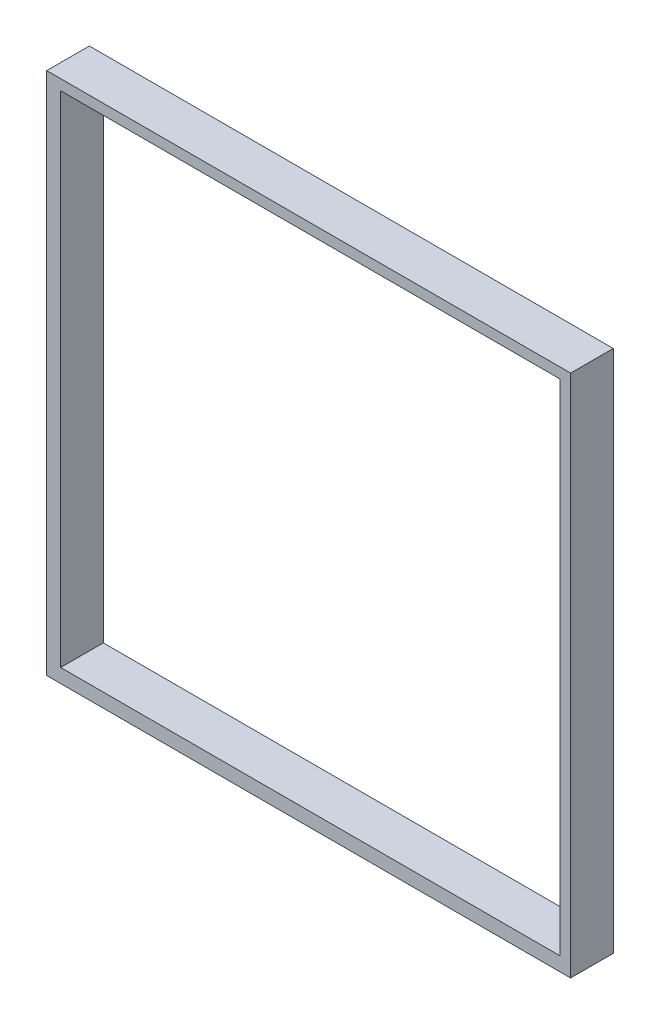
ISO-10303-21;
HEADER;
FILE_DESCRIPTION(('STEP AP214'),'2;1');
FILE_NAME('part.step','',(''),(''),'','','');
FILE_SCHEMA(('AUTOMOTIVE_DESIGN { 1 0 10303 214 1 1 1 1 }'));
ENDSEC;
DATA;
#1=APPLICATION_CONTEXT('core data for automotive mechanical design processes');
#2=APPLICATION_PROTOCOL_DEFINITION('international standard','automotive_design',2000,#1);
#3=PRODUCT_CONTEXT('',#1,'mechanical');
#4=PRODUCT('Part','Part','',(#3));
#5=PRODUCT_RELATED_PRODUCT_CATEGORY('part','',(#4));
#6=PRODUCT_DEFINITION_FORMATION('','',#4);
#7=PRODUCT_DEFINITION_CONTEXT('part definition',#1,'design');
#8=PRODUCT_DEFINITION('design','',#6,#7);
#9=PRODUCT_DEFINITION_SHAPE('','',#8);
#10=(LENGTH_UNIT() NAMED_UNIT(*) SI_UNIT(.MILLI.,.METRE.));
#11=(NAMED_UNIT(*) PLANE_ANGLE_UNIT() SI_UNIT($,.RADIAN.));
#12=(NAMED_UNIT(*) SI_UNIT($,.STERADIAN.) SOLID_ANGLE_UNIT());
#13=UNCERTAINTY_MEASURE_WITH_UNIT(LENGTH_MEASURE(1.E-05),#10,'distance_accuracy_value','');
#14=(GEOMETRIC_REPRESENTATION_CONTEXT(3) GLOBAL_UNCERTAINTY_ASSIGNED_CONTEXT((#13)) GLOBAL_UNIT_ASSIGNED_CONTEXT((#10,
#11,#12)) REPRESENTATION_CONTEXT('',''));
#15=CARTESIAN_POINT('',(0.,0.,0.));
#16=DIRECTION('',(0.,0.,1.));
#17=DIRECTION('',(1.,0.,0.));
#18=AXIS2_PLACEMENT_3D('',#15,#16,#17);
#19=CARTESIAN_POINT('',(0.,0.,3.5));
#20=DIRECTION('',(1.,0.,0.));
#21=DIRECTION('',(0.,1.,0.));
#22=AXIS2_PLACEMENT_3D('',#19,#20,#21);
#23=PLANE('',#22);
#24=DIRECTION('',(0.,-1.,0.));
#25=VECTOR('',#24,1.);
#26=CARTESIAN_POINT('',(0.,0.,0.));
#27=LINE('',#26,#25);
#28=CARTESIAN_POINT('',(0.,43.,0.));
#29=VERTEX_POINT('',#28);
#30=CARTESIAN_POINT('',(0.,0.,0.));
#31=VERTEX_POINT('',#30);
#32=EDGE_CURVE('E154',#29,#31,#27,.T.);
#33=ORIENTED_EDGE('',*,*,#32,.T.);
#34=DIRECTION('',(0.,0.,-1.));
#35=VECTOR('',#34,1.);
#36=CARTESIAN_POINT('',(0.,0.,3.5));
#37=LINE('',#36,#35);
#38=CARTESIAN_POINT('',(0.,0.,3.5));
#39=VERTEX_POINT('',#38);
#40=EDGE_CURVE('E11',#39,#31,#37,.T.);
#41=ORIENTED_EDGE('',*,*,#40,.F.);
#42=DIRECTION('',(0.,-1.,0.));
#43=VECTOR('',#42,1.);
#44=CARTESIAN_POINT('',(0.,0.,3.5));
#45=LINE('',#44,#43);
#46=CARTESIAN_POINT('',(0.,43.,3.5));
#47=VERTEX_POINT('',#46);
#48=EDGE_CURVE('E155',#47,#39,#45,.T.);
#49=ORIENTED_EDGE('',*,*,#48,.F.);
#50=DIRECTION('',(0.,0.,-1.));
#51=VECTOR('',#50,1.);
#52=CARTESIAN_POINT('',(0.,43.,3.5));
#53=LINE('',#52,#51);
#54=EDGE_CURVE('E169',#47,#29,#53,.T.);
#55=ORIENTED_EDGE('',*,*,#54,.T.);
#56=EDGE_LOOP('',(#33,#41,#49,#55));
#57=FACE_BOUND('',#56,.T.);
#58=ADVANCED_FACE('F41',(#57),#23,.F.);
#59=CARTESIAN_POINT('',(0.,0.,3.5));
#60=DIRECTION('',(0.,1.,0.));
#61=DIRECTION('',(0.,0.,1.));
#62=AXIS2_PLACEMENT_3D('',#59,#60,#61);
#63=PLANE('',#62);
#64=DIRECTION('',(1.,0.,0.));
#65=VECTOR('',#64,1.);
#66=CARTESIAN_POINT('',(0.,0.,0.));
#67=LINE('',#66,#65);
#68=CARTESIAN_POINT('',(43.,0.,0.));
#69=VERTEX_POINT('',#68);
#70=EDGE_CURVE('E173',#31,#69,#67,.T.);
#71=ORIENTED_EDGE('',*,*,#70,.T.);
#72=DIRECTION('',(0.,0.,-1.));
#73=VECTOR('',#72,1.);
#74=CARTESIAN_POINT('',(43.,0.,3.5));
#75=LINE('',#74,#73);
#76=CARTESIAN_POINT('',(43.,0.,3.5));
#77=VERTEX_POINT('',#76);
#78=EDGE_CURVE('E49',#77,#69,#75,.T.);
#79=ORIENTED_EDGE('',*,*,#78,.F.);
#80=DIRECTION('',(1.,0.,0.));
#81=VECTOR('',#80,1.);
#82=CARTESIAN_POINT('',(0.,0.,3.5));
#83=LINE('',#82,#81);
#84=EDGE_CURVE('E159',#39,#77,#83,.T.);
#85=ORIENTED_EDGE('',*,*,#84,.F.);
#86=ORIENTED_EDGE('',*,*,#40,.T.);
#87=EDGE_LOOP('',(#71,#79,#85,#86));
#88=FACE_BOUND('',#87,.T.);
#89=ADVANCED_FACE('F207',(#88),#63,.F.);
#90=CARTESIAN_POINT('',(43.,0.,3.5));
#91=DIRECTION('',(-1.,0.,0.));
#92=DIRECTION('',(0.,-1.,0.));
#93=AXIS2_PLACEMENT_3D('',#90,#91,#92);
#94=PLANE('',#93);
#95=DIRECTION('',(0.,1.,0.));
#96=VECTOR('',#95,1.);
#97=CARTESIAN_POINT('',(43.,0.,0.));
#98=LINE('',#97,#96);
#99=CARTESIAN_POINT('',(43.,43.,0.));
#100=VERTEX_POINT('',#99);
#101=EDGE_CURVE('E176',#69,#100,#98,.T.);
#102=ORIENTED_EDGE('',*,*,#101,.T.);
#103=DIRECTION('',(0.,0.,-1.));
#104=VECTOR('',#103,1.);
#105=CARTESIAN_POINT('',(43.,43.,3.5));
#106=LINE('',#105,#104);
#107=CARTESIAN_POINT('',(43.,43.,3.5));
#108=VERTEX_POINT('',#107);
#109=EDGE_CURVE('E184',#108,#100,#106,.T.);
#110=ORIENTED_EDGE('',*,*,#109,.F.);
#111=DIRECTION('',(0.,1.,0.));
#112=VECTOR('',#111,1.);
#113=CARTESIAN_POINT('',(43.,0.,3.5));
#114=LINE('',#113,#112);
#115=EDGE_CURVE('E163',#77,#108,#114,.T.);
#116=ORIENTED_EDGE('',*,*,#115,.F.);
#117=ORIENTED_EDGE('',*,*,#78,.T.);
#118=EDGE_LOOP('',(#102,#110,#116,#117));
#119=FACE_BOUND('',#118,.T.);
#120=ADVANCED_FACE('F193',(#119),#94,.F.);
#121=CARTESIAN_POINT('',(0.,43.,3.5));
#122=DIRECTION('',(0.,-1.,0.));
#123=DIRECTION('',(0.,0.,-1.));
#124=AXIS2_PLACEMENT_3D('',#121,#122,#123);
#125=PLANE('',#124);
#126=DIRECTION('',(-1.,0.,0.));
#127=VECTOR('',#126,1.);
#128=CARTESIAN_POINT('',(0.,43.,0.));
#129=LINE('',#128,#127);
#130=EDGE_CURVE('E160',#100,#29,#129,.T.);
#131=ORIENTED_EDGE('',*,*,#130,.T.);
#132=ORIENTED_EDGE('',*,*,#54,.F.);
#133=DIRECTION('',(-1.,0.,0.));
#134=VECTOR('',#133,1.);
#135=CARTESIAN_POINT('',(0.,43.,3.5));
#136=LINE('',#135,#134);
#137=EDGE_CURVE('E166',#108,#47,#136,.T.);
#138=ORIENTED_EDGE('',*,*,#137,.F.);
#139=ORIENTED_EDGE('',*,*,#109,.T.);
#140=EDGE_LOOP('',(#131,#132,#138,#139));
#141=FACE_BOUND('',#140,.T.);
#142=ADVANCED_FACE('F200',(#141),#125,.F.);
#143=CARTESIAN_POINT('',(0.,0.,3.5));
#144=DIRECTION('',(0.,0.,-1.));
#145=DIRECTION('',(-1.,0.,0.));
#146=AXIS2_PLACEMENT_3D('',#143,#144,#145);
#147=PLANE('',#146);
#148=DIRECTION('',(1.,0.,0.));
#149=VECTOR('',#148,1.);
#150=CARTESIAN_POINT('',(0.,42.1427575026813,3.5));
#151=LINE('',#150,#149);
#152=CARTESIAN_POINT('',(1.14275750268133,42.1427575026813,3.5));
#153=VERTEX_POINT('',#152);
#154=CARTESIAN_POINT('',(42.1427575026813,42.1427575026813,3.5));
#155=VERTEX_POINT('',#154);
#156=EDGE_CURVE('E146',#153,#155,#151,.T.);
#157=ORIENTED_EDGE('',*,*,#156,.T.);
#158=DIRECTION('',(0.,-1.,0.));
#159=VECTOR('',#158,1.);
#160=CARTESIAN_POINT('',(42.1427575026813,0.,3.5));
#161=LINE('',#160,#159);
#162=CARTESIAN_POINT('',(42.1427575026813,1.14275750268134,3.5));
#163=VERTEX_POINT('',#162);
#164=EDGE_CURVE('E150',#155,#163,#161,.T.);
#165=ORIENTED_EDGE('',*,*,#164,.T.);
#166=DIRECTION('',(-1.,0.,0.));
#167=VECTOR('',#166,1.);
#168=CARTESIAN_POINT('',(0.,1.14275750268134,3.5));
#169=LINE('',#168,#167);
#170=CARTESIAN_POINT('',(1.14275750268131,1.14275750268134,3.5));
#171=VERTEX_POINT('',#170);
#172=EDGE_CURVE('E137',#163,#171,#169,.T.);
#173=ORIENTED_EDGE('',*,*,#172,.T.);
#174=DIRECTION('',(0.,1.,0.));
#175=VECTOR('',#174,1.);
#176=CARTESIAN_POINT('',(1.14275750268131,0.,3.5));
#177=LINE('',#176,#175);
#178=EDGE_CURVE('E112',#171,#153,#177,.T.);
#179=ORIENTED_EDGE('',*,*,#178,.T.);
#180=EDGE_LOOP('',(#157,#165,#173,#179));
#181=FACE_BOUND('',#180,.T.);
#182=ORIENTED_EDGE('',*,*,#48,.T.);
#183=ORIENTED_EDGE('',*,*,#84,.T.);
#184=ORIENTED_EDGE('',*,*,#115,.T.);
#185=ORIENTED_EDGE('',*,*,#137,.T.);
#186=EDGE_LOOP('',(#182,#183,#184,#185));
#187=FACE_BOUND('',#186,.T.);
#188=ADVANCED_FACE('F206',(#181,#187),#147,.F.);
#189=CARTESIAN_POINT('',(0.,0.,0.));
#190=DIRECTION('',(0.,0.,-1.));
#191=DIRECTION('',(-1.,0.,0.));
#192=AXIS2_PLACEMENT_3D('',#189,#190,#191);
#193=PLANE('',#192);
#194=DIRECTION('',(0.,-1.,0.));
#195=VECTOR('',#194,1.);
#196=CARTESIAN_POINT('',(42.1427575026813,42.1427575026813,0.));
#197=LINE('',#196,#195);
#198=CARTESIAN_POINT('',(42.1427575026813,42.1427575026813,0.));
#199=VERTEX_POINT('',#198);
#200=CARTESIAN_POINT('',(42.1427575026813,1.14275750268134,0.));
#201=VERTEX_POINT('',#200);
#202=EDGE_CURVE('E64',#199,#201,#197,.T.);
#203=ORIENTED_EDGE('',*,*,#202,.F.);
#204=DIRECTION('',(1.,0.,0.));
#205=VECTOR('',#204,1.);
#206=CARTESIAN_POINT('',(42.1427575026813,42.1427575026813,0.));
#207=LINE('',#206,#205);
#208=CARTESIAN_POINT('',(1.14275750268133,42.1427575026813,0.));
#209=VERTEX_POINT('',#208);
#210=EDGE_CURVE('E127',#209,#199,#207,.T.);
#211=ORIENTED_EDGE('',*,*,#210,.F.);
#212=DIRECTION('',(0.,1.,0.));
#213=VECTOR('',#212,1.);
#214=CARTESIAN_POINT('',(1.14275750268133,42.1427575026813,0.));
#215=LINE('',#214,#213);
#216=CARTESIAN_POINT('',(1.14275750268131,1.14275750268134,0.));
#217=VERTEX_POINT('',#216);
#218=EDGE_CURVE('E109',#217,#209,#215,.T.);
#219=ORIENTED_EDGE('',*,*,#218,.F.);
#220=DIRECTION('',(-1.,0.,0.));
#221=VECTOR('',#220,1.);
#222=CARTESIAN_POINT('',(42.1427575026813,1.14275750268134,0.));
#223=LINE('',#222,#221);
#224=EDGE_CURVE('E119',#201,#217,#223,.T.);
#225=ORIENTED_EDGE('',*,*,#224,.F.);
#226=EDGE_LOOP('',(#203,#211,#219,#225));
#227=FACE_BOUND('',#226,.T.);
#228=ORIENTED_EDGE('',*,*,#32,.F.);
#229=ORIENTED_EDGE('',*,*,#130,.F.);
#230=ORIENTED_EDGE('',*,*,#101,.F.);
#231=ORIENTED_EDGE('',*,*,#70,.F.);
#232=EDGE_LOOP('',(#228,#229,#230,#231));
#233=FACE_BOUND('',#232,.T.);
#234=ADVANCED_FACE('F124',(#227,#233),#193,.T.);
#235=CARTESIAN_POINT('',(42.1427575026813,42.1427575026813,15.5));
#236=DIRECTION('',(1.,0.,0.));
#237=DIRECTION('',(0.,0.,-1.));
#238=AXIS2_PLACEMENT_3D('',#235,#236,#237);
#239=PLANE('',#238);
#240=DIRECTION('',(0.,0.,-1.));
#241=VECTOR('',#240,1.);
#242=CARTESIAN_POINT('',(42.1427575026813,42.1427575026813,15.5));
#243=LINE('',#242,#241);
#244=EDGE_CURVE('E134',#155,#199,#243,.T.);
#245=ORIENTED_EDGE('',*,*,#244,.T.);
#246=ORIENTED_EDGE('',*,*,#202,.T.);
#247=DIRECTION('',(0.,0.,-1.));
#248=VECTOR('',#247,1.);
#249=CARTESIAN_POINT('',(42.1427575026813,1.14275750268134,15.5));
#250=LINE('',#249,#248);
#251=EDGE_CURVE('E116',#163,#201,#250,.T.);
#252=ORIENTED_EDGE('',*,*,#251,.F.);
#253=ORIENTED_EDGE('',*,*,#164,.F.);
#254=EDGE_LOOP('',(#245,#246,#252,#253));
#255=FACE_BOUND('',#254,.T.);
#256=ADVANCED_FACE('F219',(#255),#239,.F.);
#257=CARTESIAN_POINT('',(42.1427575026813,42.1427575026813,15.5));
#258=DIRECTION('',(0.,1.,0.));
#259=DIRECTION('',(0.,0.,1.));
#260=AXIS2_PLACEMENT_3D('',#257,#258,#259);
#261=PLANE('',#260);
#262=DIRECTION('',(0.,0.,-1.));
#263=VECTOR('',#262,1.);
#264=CARTESIAN_POINT('',(1.14275750268133,42.1427575026813,15.5));
#265=LINE('',#264,#263);
#266=EDGE_CURVE('E115',#153,#209,#265,.T.);
#267=ORIENTED_EDGE('',*,*,#266,.T.);
#268=ORIENTED_EDGE('',*,*,#210,.T.);
#269=ORIENTED_EDGE('',*,*,#244,.F.);
#270=ORIENTED_EDGE('',*,*,#156,.F.);
#271=EDGE_LOOP('',(#267,#268,#269,#270));
#272=FACE_BOUND('',#271,.T.);
#273=ADVANCED_FACE('F225',(#272),#261,.F.);
#274=CARTESIAN_POINT('',(1.14275750268133,42.1427575026813,15.5));
#275=DIRECTION('',(-1.,0.,0.));
#276=DIRECTION('',(0.,-1.,0.));
#277=AXIS2_PLACEMENT_3D('',#274,#275,#276);
#278=PLANE('',#277);
#279=DIRECTION('',(0.,0.,-1.));
#280=VECTOR('',#279,1.);
#281=CARTESIAN_POINT('',(1.14275750268131,1.14275750268134,15.5));
#282=LINE('',#281,#280);
#283=EDGE_CURVE('E56',#171,#217,#282,.T.);
#284=ORIENTED_EDGE('',*,*,#283,.T.);
#285=ORIENTED_EDGE('',*,*,#218,.T.);
#286=ORIENTED_EDGE('',*,*,#266,.F.);
#287=ORIENTED_EDGE('',*,*,#178,.F.);
#288=EDGE_LOOP('',(#284,#285,#286,#287));
#289=FACE_BOUND('',#288,.T.);
#290=ADVANCED_FACE('F106',(#289),#278,.F.);
#291=CARTESIAN_POINT('',(42.1427575026813,1.14275750268134,15.5));
#292=DIRECTION('',(0.,-1.,0.));
#293=DIRECTION('',(0.,0.,-1.));
#294=AXIS2_PLACEMENT_3D('',#291,#292,#293);
#295=PLANE('',#294);
#296=ORIENTED_EDGE('',*,*,#251,.T.);
#297=ORIENTED_EDGE('',*,*,#224,.T.);
#298=ORIENTED_EDGE('',*,*,#283,.F.);
#299=ORIENTED_EDGE('',*,*,#172,.F.);
#300=EDGE_LOOP('',(#296,#297,#298,#299));
#301=FACE_BOUND('',#300,.T.);
#302=ADVANCED_FACE('F120',(#301),#295,.F.);
#303=CLOSED_SHELL('',(#58,#89,#120,#142,#188,#234,#256,#273,#290,#302));
#304=MANIFOLD_SOLID_BREP('B2',#303);
#305=ADVANCED_BREP_SHAPE_REPRESENTATION('',(#18,#304),#14);
#306=SHAPE_DEFINITION_REPRESENTATION(#9,#305);
ENDSEC;
END-ISO-10303-21;
